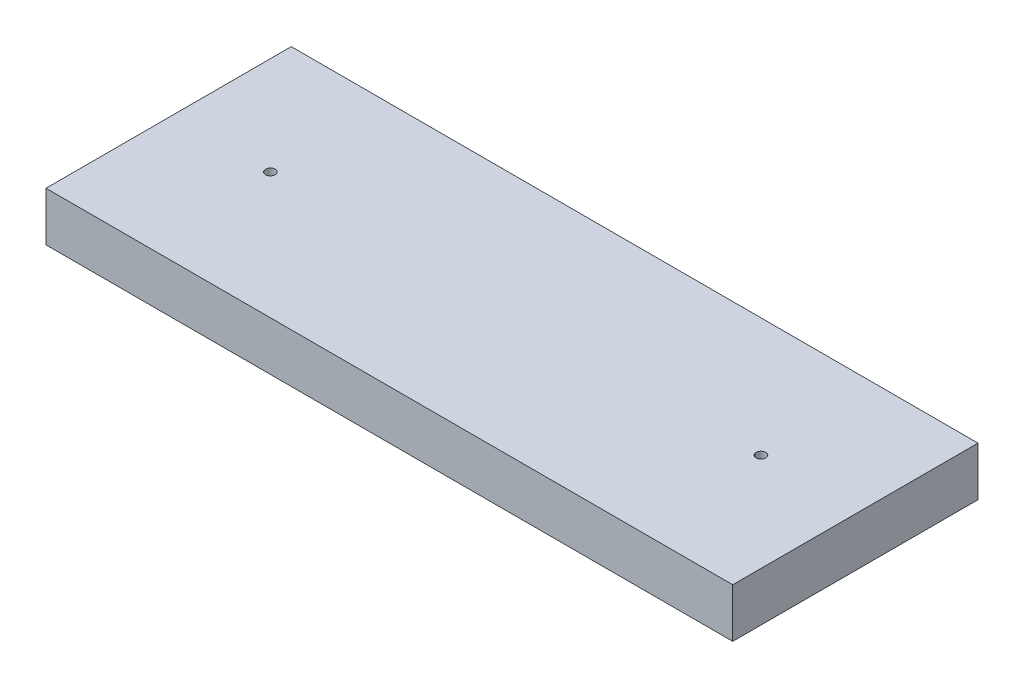
ISO-10303-21;
HEADER;
FILE_DESCRIPTION(('STEP AP214'),'2;1');
FILE_NAME('part.step','',(''),(''),'','','');
FILE_SCHEMA(('AUTOMOTIVE_DESIGN { 1 0 10303 214 1 1 1 1 }'));
ENDSEC;
DATA;
#1=APPLICATION_CONTEXT('core data for automotive mechanical design processes');
#2=APPLICATION_PROTOCOL_DEFINITION('international standard','automotive_design',2000,#1);
#3=PRODUCT_CONTEXT('',#1,'mechanical');
#4=PRODUCT('Part','Part','',(#3));
#5=PRODUCT_RELATED_PRODUCT_CATEGORY('part','',(#4));
#6=PRODUCT_DEFINITION_FORMATION('','',#4);
#7=PRODUCT_DEFINITION_CONTEXT('part definition',#1,'design');
#8=PRODUCT_DEFINITION('design','',#6,#7);
#9=PRODUCT_DEFINITION_SHAPE('','',#8);
#10=(LENGTH_UNIT() NAMED_UNIT(*) SI_UNIT(.MILLI.,.METRE.));
#11=(NAMED_UNIT(*) PLANE_ANGLE_UNIT() SI_UNIT($,.RADIAN.));
#12=(NAMED_UNIT(*) SI_UNIT($,.STERADIAN.) SOLID_ANGLE_UNIT());
#13=UNCERTAINTY_MEASURE_WITH_UNIT(LENGTH_MEASURE(1.E-05),#10,'distance_accuracy_value','');
#14=(GEOMETRIC_REPRESENTATION_CONTEXT(3) GLOBAL_UNCERTAINTY_ASSIGNED_CONTEXT((#13)) GLOBAL_UNIT_ASSIGNED_CONTEXT((#10,
#11,#12)) REPRESENTATION_CONTEXT('',''));
#15=CARTESIAN_POINT('',(0.,0.,0.));
#16=DIRECTION('',(0.,0.,1.));
#17=DIRECTION('',(1.,0.,0.));
#18=AXIS2_PLACEMENT_3D('',#15,#16,#17);
#19=CARTESIAN_POINT('',(355.6,50.8,127.));
#20=DIRECTION('',(0.,0.,1.));
#21=DIRECTION('',(1.,0.,0.));
#22=AXIS2_PLACEMENT_3D('',#19,#20,#21);
#23=PLANE('',#22);
#24=DIRECTION('',(-1.,0.,0.));
#25=VECTOR('',#24,1.);
#26=CARTESIAN_POINT('',(355.6,0.,127.));
#27=LINE('',#26,#25);
#28=CARTESIAN_POINT('',(355.6,0.,127.));
#29=VERTEX_POINT('',#28);
#30=CARTESIAN_POINT('',(-355.6,0.,127.));
#31=VERTEX_POINT('',#30);
#32=EDGE_CURVE('E100',#29,#31,#27,.T.);
#33=ORIENTED_EDGE('',*,*,#32,.F.);
#34=DIRECTION('',(0.,-1.,0.));
#35=VECTOR('',#34,1.);
#36=CARTESIAN_POINT('',(355.6,50.8,127.));
#37=LINE('',#36,#35);
#38=CARTESIAN_POINT('',(355.6,50.8,127.));
#39=VERTEX_POINT('',#38);
#40=EDGE_CURVE('E11',#39,#29,#37,.T.);
#41=ORIENTED_EDGE('',*,*,#40,.F.);
#42=DIRECTION('',(-1.,0.,0.));
#43=VECTOR('',#42,1.);
#44=CARTESIAN_POINT('',(355.6,50.8,127.));
#45=LINE('',#44,#43);
#46=CARTESIAN_POINT('',(-355.6,50.8,127.));
#47=VERTEX_POINT('',#46);
#48=EDGE_CURVE('E94',#39,#47,#45,.T.);
#49=ORIENTED_EDGE('',*,*,#48,.T.);
#50=DIRECTION('',(0.,-1.,0.));
#51=VECTOR('',#50,1.);
#52=CARTESIAN_POINT('',(-355.6,50.8,127.));
#53=LINE('',#52,#51);
#54=EDGE_CURVE('E37',#47,#31,#53,.T.);
#55=ORIENTED_EDGE('',*,*,#54,.T.);
#56=EDGE_LOOP('',(#33,#41,#49,#55));
#57=FACE_BOUND('',#56,.T.);
#58=ADVANCED_FACE('F34',(#57),#23,.T.);
#59=CARTESIAN_POINT('',(355.6,50.8,127.));
#60=DIRECTION('',(-1.,0.,0.));
#61=DIRECTION('',(0.,0.,1.));
#62=AXIS2_PLACEMENT_3D('',#59,#60,#61);
#63=PLANE('',#62);
#64=DIRECTION('',(0.,0.,-1.));
#65=VECTOR('',#64,1.);
#66=CARTESIAN_POINT('',(355.6,0.,127.));
#67=LINE('',#66,#65);
#68=CARTESIAN_POINT('',(355.6,0.,-127.));
#69=VERTEX_POINT('',#68);
#70=EDGE_CURVE('E67',#29,#69,#67,.T.);
#71=ORIENTED_EDGE('',*,*,#70,.T.);
#72=DIRECTION('',(0.,-1.,0.));
#73=VECTOR('',#72,1.);
#74=CARTESIAN_POINT('',(355.6,50.8,-127.));
#75=LINE('',#74,#73);
#76=CARTESIAN_POINT('',(355.6,50.8,-127.));
#77=VERTEX_POINT('',#76);
#78=EDGE_CURVE('E43',#77,#69,#75,.T.);
#79=ORIENTED_EDGE('',*,*,#78,.F.);
#80=DIRECTION('',(0.,0.,-1.));
#81=VECTOR('',#80,1.);
#82=CARTESIAN_POINT('',(355.6,50.8,127.));
#83=LINE('',#82,#81);
#84=EDGE_CURVE('E84',#39,#77,#83,.T.);
#85=ORIENTED_EDGE('',*,*,#84,.F.);
#86=ORIENTED_EDGE('',*,*,#40,.T.);
#87=EDGE_LOOP('',(#71,#79,#85,#86));
#88=FACE_BOUND('',#87,.T.);
#89=ADVANCED_FACE('F111',(#88),#63,.F.);
#90=CARTESIAN_POINT('',(355.6,50.8,-127.));
#91=DIRECTION('',(0.,0.,1.));
#92=DIRECTION('',(1.,0.,0.));
#93=AXIS2_PLACEMENT_3D('',#90,#91,#92);
#94=PLANE('',#93);
#95=DIRECTION('',(-1.,0.,0.));
#96=VECTOR('',#95,1.);
#97=CARTESIAN_POINT('',(355.6,0.,-127.));
#98=LINE('',#97,#96);
#99=CARTESIAN_POINT('',(-355.6,0.,-127.));
#100=VERTEX_POINT('',#99);
#101=EDGE_CURVE('E91',#69,#100,#98,.T.);
#102=ORIENTED_EDGE('',*,*,#101,.T.);
#103=DIRECTION('',(0.,-1.,0.));
#104=VECTOR('',#103,1.);
#105=CARTESIAN_POINT('',(-355.6,50.8,-127.));
#106=LINE('',#105,#104);
#107=CARTESIAN_POINT('',(-355.6,50.8,-127.));
#108=VERTEX_POINT('',#107);
#109=EDGE_CURVE('E88',#108,#100,#106,.T.);
#110=ORIENTED_EDGE('',*,*,#109,.F.);
#111=DIRECTION('',(-1.,0.,0.));
#112=VECTOR('',#111,1.);
#113=CARTESIAN_POINT('',(355.6,50.8,-127.));
#114=LINE('',#113,#112);
#115=EDGE_CURVE('E79',#77,#108,#114,.T.);
#116=ORIENTED_EDGE('',*,*,#115,.F.);
#117=ORIENTED_EDGE('',*,*,#78,.T.);
#118=EDGE_LOOP('',(#102,#110,#116,#117));
#119=FACE_BOUND('',#118,.T.);
#120=ADVANCED_FACE('F89',(#119),#94,.F.);
#121=CARTESIAN_POINT('',(-355.6,50.8,127.));
#122=DIRECTION('',(-1.,0.,0.));
#123=DIRECTION('',(0.,0.,1.));
#124=AXIS2_PLACEMENT_3D('',#121,#122,#123);
#125=PLANE('',#124);
#126=DIRECTION('',(0.,0.,-1.));
#127=VECTOR('',#126,1.);
#128=CARTESIAN_POINT('',(-355.6,0.,127.));
#129=LINE('',#128,#127);
#130=EDGE_CURVE('E103',#31,#100,#129,.T.);
#131=ORIENTED_EDGE('',*,*,#130,.F.);
#132=ORIENTED_EDGE('',*,*,#54,.F.);
#133=DIRECTION('',(0.,0.,-1.));
#134=VECTOR('',#133,1.);
#135=CARTESIAN_POINT('',(-355.6,50.8,127.));
#136=LINE('',#135,#134);
#137=EDGE_CURVE('E83',#47,#108,#136,.T.);
#138=ORIENTED_EDGE('',*,*,#137,.T.);
#139=ORIENTED_EDGE('',*,*,#109,.T.);
#140=EDGE_LOOP('',(#131,#132,#138,#139));
#141=FACE_BOUND('',#140,.T.);
#142=ADVANCED_FACE('F93',(#141),#125,.T.);
#143=CARTESIAN_POINT('',(0.,50.8,0.));
#144=DIRECTION('',(0.,-1.,0.));
#145=DIRECTION('',(0.,0.,-1.));
#146=AXIS2_PLACEMENT_3D('',#143,#144,#145);
#147=PLANE('',#146);
#148=CARTESIAN_POINT('',(-254.,50.8,-3.81000000000006));
#149=DIRECTION('',(0.,1.,0.));
#150=DIRECTION('',(0.,0.,1.));
#151=AXIS2_PLACEMENT_3D('',#148,#149,#150);
#152=CIRCLE('',#151,4.99999999999998);
#153=CARTESIAN_POINT('',(-254.,50.8,1.18999999999991));
#154=VERTEX_POINT('',#153);
#155=EDGE_CURVE('E148',#154,#154,#152,.T.);
#156=ORIENTED_EDGE('',*,*,#155,.F.);
#157=EDGE_LOOP('',(#156));
#158=FACE_BOUND('',#157,.T.);
#159=CARTESIAN_POINT('',(254.,50.8,-3.81000000000013));
#160=DIRECTION('',(0.,1.,0.));
#161=DIRECTION('',(0.,0.,1.));
#162=AXIS2_PLACEMENT_3D('',#159,#160,#161);
#163=CIRCLE('',#162,5.);
#164=CARTESIAN_POINT('',(254.,50.8,1.18999999999988));
#165=VERTEX_POINT('',#164);
#166=EDGE_CURVE('E150',#165,#165,#163,.T.);
#167=ORIENTED_EDGE('',*,*,#166,.F.);
#168=EDGE_LOOP('',(#167));
#169=FACE_BOUND('',#168,.T.);
#170=ORIENTED_EDGE('',*,*,#48,.F.);
#171=ORIENTED_EDGE('',*,*,#84,.T.);
#172=ORIENTED_EDGE('',*,*,#115,.T.);
#173=ORIENTED_EDGE('',*,*,#137,.F.);
#174=EDGE_LOOP('',(#170,#171,#172,#173));
#175=FACE_BOUND('',#174,.T.);
#176=ADVANCED_FACE('F82',(#158,#169,#175),#147,.F.);
#177=CARTESIAN_POINT('',(0.,0.,0.));
#178=DIRECTION('',(0.,-1.,0.));
#179=DIRECTION('',(0.,0.,-1.));
#180=AXIS2_PLACEMENT_3D('',#177,#178,#179);
#181=PLANE('',#180);
#182=CARTESIAN_POINT('',(-254.,0.,-3.81000000000006));
#183=DIRECTION('',(0.,1.,0.));
#184=DIRECTION('',(0.,0.,1.));
#185=AXIS2_PLACEMENT_3D('',#182,#183,#184);
#186=CIRCLE('',#185,4.99999999999995);
#187=CARTESIAN_POINT('',(-254.,0.,1.18999999999989));
#188=VERTEX_POINT('',#187);
#189=EDGE_CURVE('E146',#188,#188,#186,.T.);
#190=ORIENTED_EDGE('',*,*,#189,.T.);
#191=EDGE_LOOP('',(#190));
#192=FACE_BOUND('',#191,.T.);
#193=CARTESIAN_POINT('',(254.,0.,-3.81000000000013));
#194=DIRECTION('',(0.,1.,0.));
#195=DIRECTION('',(0.,0.,1.));
#196=AXIS2_PLACEMENT_3D('',#193,#194,#195);
#197=CIRCLE('',#196,4.99999999999995);
#198=CARTESIAN_POINT('',(254.,0.,1.18999999999982));
#199=VERTEX_POINT('',#198);
#200=EDGE_CURVE('E104',#199,#199,#197,.T.);
#201=ORIENTED_EDGE('',*,*,#200,.T.);
#202=EDGE_LOOP('',(#201));
#203=FACE_BOUND('',#202,.T.);
#204=ORIENTED_EDGE('',*,*,#32,.T.);
#205=ORIENTED_EDGE('',*,*,#130,.T.);
#206=ORIENTED_EDGE('',*,*,#101,.F.);
#207=ORIENTED_EDGE('',*,*,#70,.F.);
#208=EDGE_LOOP('',(#204,#205,#206,#207));
#209=FACE_BOUND('',#208,.T.);
#210=ADVANCED_FACE('F109',(#192,#203,#209),#181,.T.);
#211=CARTESIAN_POINT('',(254.,50.8,-3.81000000000013));
#212=DIRECTION('',(0.,1.,0.));
#213=DIRECTION('',(0.,0.,1.));
#214=AXIS2_PLACEMENT_3D('',#211,#212,#213);
#215=CYLINDRICAL_SURFACE('',#214,4.99999999999998);
#216=ORIENTED_EDGE('',*,*,#200,.F.);
#217=EDGE_LOOP('',(#216));
#218=FACE_BOUND('',#217,.T.);
#219=ORIENTED_EDGE('',*,*,#166,.T.);
#220=EDGE_LOOP('',(#219));
#221=FACE_BOUND('',#220,.T.);
#222=ADVANCED_FACE('F130',(#218,#221),#215,.F.);
#223=CARTESIAN_POINT('',(-254.,50.8,-3.81000000000006));
#224=DIRECTION('',(0.,1.,0.));
#225=DIRECTION('',(0.,0.,1.));
#226=AXIS2_PLACEMENT_3D('',#223,#224,#225);
#227=CYLINDRICAL_SURFACE('',#226,4.99999999999996);
#228=ORIENTED_EDGE('',*,*,#189,.F.);
#229=EDGE_LOOP('',(#228));
#230=FACE_BOUND('',#229,.T.);
#231=ORIENTED_EDGE('',*,*,#155,.T.);
#232=EDGE_LOOP('',(#231));
#233=FACE_BOUND('',#232,.T.);
#234=ADVANCED_FACE('F137',(#230,#233),#227,.F.);
#235=CLOSED_SHELL('',(#58,#89,#120,#142,#176,#210,#222,#234));
#236=MANIFOLD_SOLID_BREP('B2',#235);
#237=ADVANCED_BREP_SHAPE_REPRESENTATION('',(#18,#236),#14);
#238=SHAPE_DEFINITION_REPRESENTATION(#9,#237);
ENDSEC;
END-ISO-10303-21;
